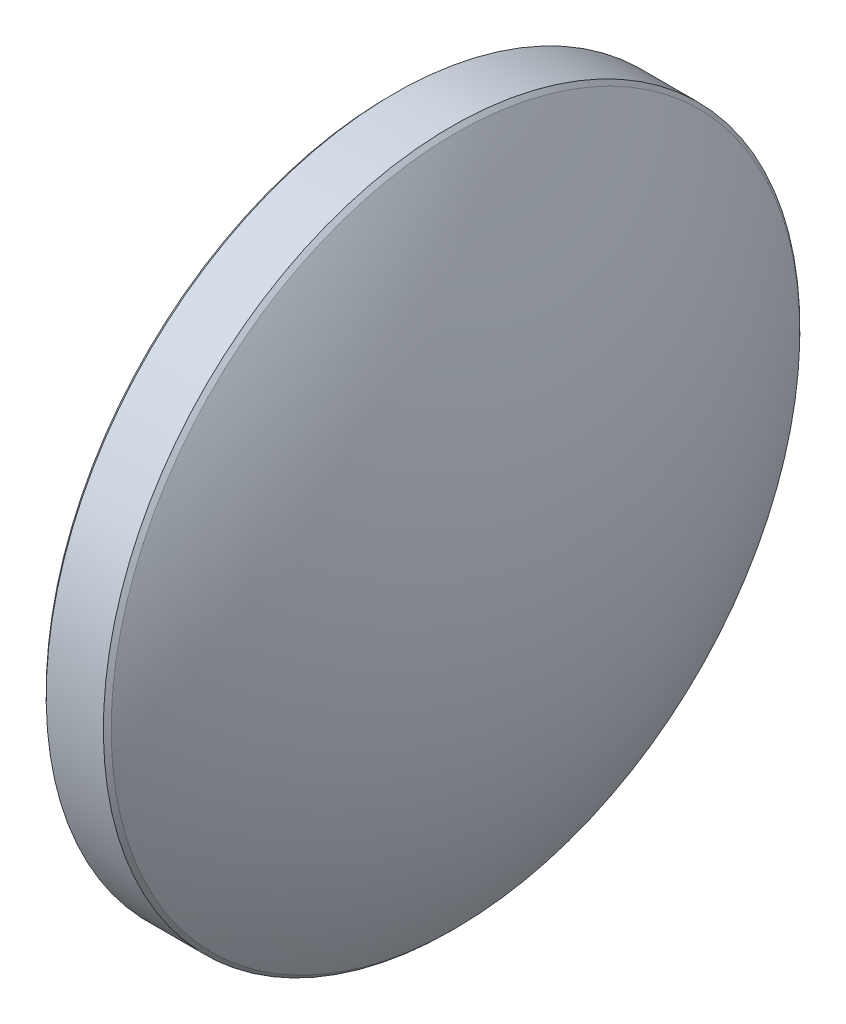
ISO-10303-21;
HEADER;
FILE_DESCRIPTION(('STEP AP214'),'2;1');
FILE_NAME('part.step','',(''),(''),'','','');
FILE_SCHEMA(('AUTOMOTIVE_DESIGN { 1 0 10303 214 1 1 1 1 }'));
ENDSEC;
DATA;
#1=APPLICATION_CONTEXT('core data for automotive mechanical design processes');
#2=APPLICATION_PROTOCOL_DEFINITION('international standard','automotive_design',2000,#1);
#3=PRODUCT_CONTEXT('',#1,'mechanical');
#4=PRODUCT('Part','Part','',(#3));
#5=PRODUCT_RELATED_PRODUCT_CATEGORY('part','',(#4));
#6=PRODUCT_DEFINITION_FORMATION('','',#4);
#7=PRODUCT_DEFINITION_CONTEXT('part definition',#1,'design');
#8=PRODUCT_DEFINITION('design','',#6,#7);
#9=PRODUCT_DEFINITION_SHAPE('','',#8);
#10=(LENGTH_UNIT() NAMED_UNIT(*) SI_UNIT(.MILLI.,.METRE.));
#11=(NAMED_UNIT(*) PLANE_ANGLE_UNIT() SI_UNIT($,.RADIAN.));
#12=(NAMED_UNIT(*) SI_UNIT($,.STERADIAN.) SOLID_ANGLE_UNIT());
#13=UNCERTAINTY_MEASURE_WITH_UNIT(LENGTH_MEASURE(1.E-05),#10,'distance_accuracy_value','');
#14=(GEOMETRIC_REPRESENTATION_CONTEXT(3) GLOBAL_UNCERTAINTY_ASSIGNED_CONTEXT((#13)) GLOBAL_UNIT_ASSIGNED_CONTEXT((#10,
#11,#12)) REPRESENTATION_CONTEXT('',''));
#15=CARTESIAN_POINT('',(0.,0.,0.));
#16=DIRECTION('',(0.,0.,1.));
#17=DIRECTION('',(1.,0.,0.));
#18=AXIS2_PLACEMENT_3D('',#15,#16,#17);
#19=CARTESIAN_POINT('',(131.35,0.,0.));
#20=DIRECTION('',(-1.,0.,0.));
#21=DIRECTION('',(0.,-1.,0.));
#22=AXIS2_PLACEMENT_3D('',#19,#20,#21);
#23=SPHERICAL_SURFACE('',#22,134.6);
#24=CARTESIAN_POINT('',(-2.66284305038988,0.,0.));
#25=DIRECTION('',(-1.,0.,0.));
#26=DIRECTION('',(0.,-1.,0.));
#27=AXIS2_PLACEMENT_3D('',#24,#25,#26);
#28=CIRCLE('',#27,12.5585786437627);
#29=CARTESIAN_POINT('',(-2.66284305038988,-12.5585786437627,0.));
#30=VERTEX_POINT('',#29);
#31=EDGE_CURVE('E28',#30,#30,#28,.T.);
#32=ORIENTED_EDGE('',*,*,#31,.T.);
#33=EDGE_LOOP('',(#32));
#34=FACE_BOUND('',#33,.T.);
#35=ADVANCED_FACE('F14',(#34),#23,.T.);
#36=CARTESIAN_POINT('',(-20.77,0.,0.));
#37=DIRECTION('',(-1.,0.,0.));
#38=DIRECTION('',(0.,1.,0.));
#39=AXIS2_PLACEMENT_3D('',#36,#37,#38);
#40=SPHERICAL_SURFACE('',#39,24.02);
#41=CARTESIAN_POINT('',(-0.294587856445295,0.,0.));
#42=DIRECTION('',(-1.,0.,0.));
#43=DIRECTION('',(0.,-1.,0.));
#44=AXIS2_PLACEMENT_3D('',#41,#42,#43);
#45=CIRCLE('',#44,12.5585786437627);
#46=CARTESIAN_POINT('',(-0.294587856445295,-12.5585786437627,0.));
#47=VERTEX_POINT('',#46);
#48=EDGE_CURVE('E10',#47,#47,#45,.T.);
#49=ORIENTED_EDGE('',*,*,#48,.F.);
#50=EDGE_LOOP('',(#49));
#51=FACE_BOUND('',#50,.T.);
#52=ADVANCED_FACE('F49',(#51),#40,.T.);
#53=CARTESIAN_POINT('',(-0.294587856445295,0.,0.));
#54=DIRECTION('',(-1.,0.,0.));
#55=DIRECTION('',(0.,-1.,0.));
#56=AXIS2_PLACEMENT_3D('',#53,#54,#55);
#57=CONICAL_SURFACE('',#56,12.5585786437627,0.785398163397445);
#58=CARTESIAN_POINT('',(-0.436009212682599,0.,0.));
#59=DIRECTION('',(-1.,0.,0.));
#60=DIRECTION('',(0.,-1.,0.));
#61=AXIS2_PLACEMENT_3D('',#58,#59,#60);
#62=CIRCLE('',#61,12.7);
#63=CARTESIAN_POINT('',(-0.436009212682599,-12.7,0.));
#64=VERTEX_POINT('',#63);
#65=EDGE_CURVE('E20',#64,#64,#62,.T.);
#66=ORIENTED_EDGE('',*,*,#65,.F.);
#67=EDGE_LOOP('',(#66));
#68=FACE_BOUND('',#67,.T.);
#69=ORIENTED_EDGE('',*,*,#48,.T.);
#70=EDGE_LOOP('',(#69));
#71=FACE_BOUND('',#70,.T.);
#72=ADVANCED_FACE('F43',(#68,#71),#57,.T.);
#73=CARTESIAN_POINT('',(-3.25,0.,0.));
#74=DIRECTION('',(-1.,0.,0.));
#75=DIRECTION('',(0.,-1.,0.));
#76=AXIS2_PLACEMENT_3D('',#73,#74,#75);
#77=CYLINDRICAL_SURFACE('',#76,12.7);
#78=CARTESIAN_POINT('',(-2.52142169415257,0.,0.));
#79=DIRECTION('',(-1.,0.,0.));
#80=DIRECTION('',(0.,-1.,0.));
#81=AXIS2_PLACEMENT_3D('',#78,#79,#80);
#82=CIRCLE('',#81,12.7);
#83=CARTESIAN_POINT('',(-2.52142169415257,-12.7,0.));
#84=VERTEX_POINT('',#83);
#85=EDGE_CURVE('E24',#84,#84,#82,.T.);
#86=ORIENTED_EDGE('',*,*,#85,.F.);
#87=EDGE_LOOP('',(#86));
#88=FACE_BOUND('',#87,.T.);
#89=ORIENTED_EDGE('',*,*,#65,.T.);
#90=EDGE_LOOP('',(#89));
#91=FACE_BOUND('',#90,.T.);
#92=ADVANCED_FACE('F38',(#88,#91),#77,.T.);
#93=CARTESIAN_POINT('',(-2.52142169415257,0.,0.));
#94=DIRECTION('',(1.,0.,0.));
#95=DIRECTION('',(0.,1.,0.));
#96=AXIS2_PLACEMENT_3D('',#93,#94,#95);
#97=CONICAL_SURFACE('',#96,12.7,0.785398163397442);
#98=ORIENTED_EDGE('',*,*,#31,.F.);
#99=EDGE_LOOP('',(#98));
#100=FACE_BOUND('',#99,.T.);
#101=ORIENTED_EDGE('',*,*,#85,.T.);
#102=EDGE_LOOP('',(#101));
#103=FACE_BOUND('',#102,.T.);
#104=ADVANCED_FACE('F35',(#100,#103),#97,.T.);
#105=CLOSED_SHELL('',(#35,#52,#72,#92,#104));
#106=MANIFOLD_SOLID_BREP('B1',#105);
#107=ADVANCED_BREP_SHAPE_REPRESENTATION('',(#18,#106),#14);
#108=SHAPE_DEFINITION_REPRESENTATION(#9,#107);
ENDSEC;
END-ISO-10303-21;
